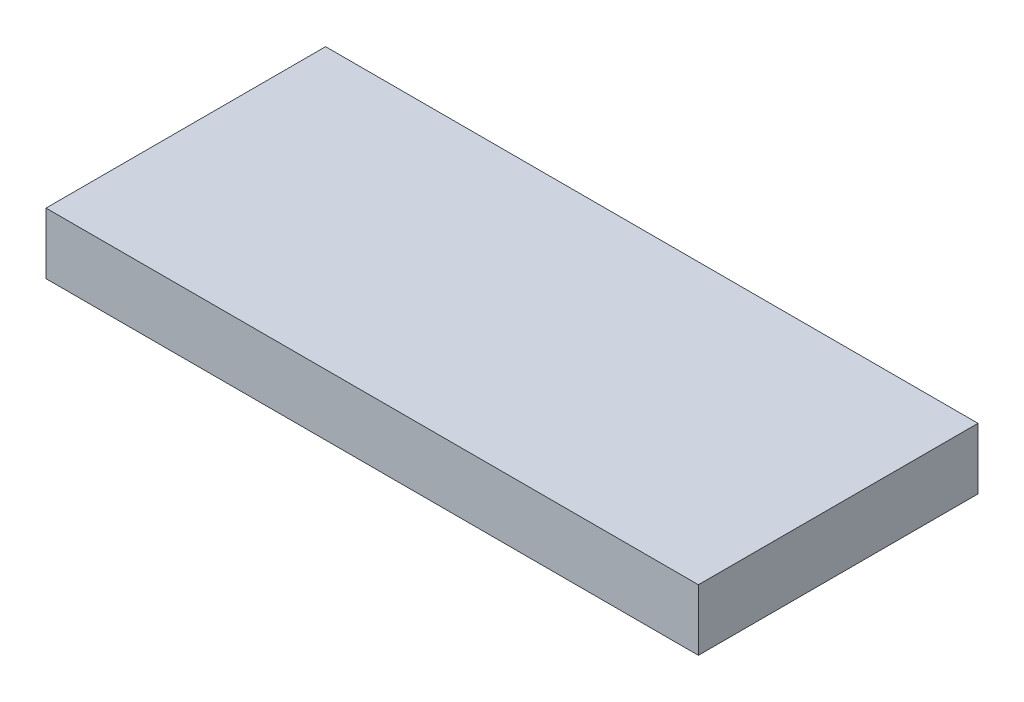
ISO-10303-21;
HEADER;
FILE_DESCRIPTION(('STEP AP214'),'2;1');
FILE_NAME('part.step','',(''),(''),'','','');
FILE_SCHEMA(('AUTOMOTIVE_DESIGN { 1 0 10303 214 1 1 1 1 }'));
ENDSEC;
DATA;
#1=APPLICATION_CONTEXT('core data for automotive mechanical design processes');
#2=APPLICATION_PROTOCOL_DEFINITION('international standard','automotive_design',2000,#1);
#3=PRODUCT_CONTEXT('',#1,'mechanical');
#4=PRODUCT('Part','Part','',(#3));
#5=PRODUCT_RELATED_PRODUCT_CATEGORY('part','',(#4));
#6=PRODUCT_DEFINITION_FORMATION('','',#4);
#7=PRODUCT_DEFINITION_CONTEXT('part definition',#1,'design');
#8=PRODUCT_DEFINITION('design','',#6,#7);
#9=PRODUCT_DEFINITION_SHAPE('','',#8);
#10=(LENGTH_UNIT() NAMED_UNIT(*) SI_UNIT(.MILLI.,.METRE.));
#11=(NAMED_UNIT(*) PLANE_ANGLE_UNIT() SI_UNIT($,.RADIAN.));
#12=(NAMED_UNIT(*) SI_UNIT($,.STERADIAN.) SOLID_ANGLE_UNIT());
#13=UNCERTAINTY_MEASURE_WITH_UNIT(LENGTH_MEASURE(1.E-05),#10,'distance_accuracy_value','');
#14=(GEOMETRIC_REPRESENTATION_CONTEXT(3) GLOBAL_UNCERTAINTY_ASSIGNED_CONTEXT((#13)) GLOBAL_UNIT_ASSIGNED_CONTEXT((#10,
#11,#12)) REPRESENTATION_CONTEXT('',''));
#15=CARTESIAN_POINT('',(0.,0.,0.));
#16=DIRECTION('',(0.,0.,1.));
#17=DIRECTION('',(1.,0.,0.));
#18=AXIS2_PLACEMENT_3D('',#15,#16,#17);
#19=CARTESIAN_POINT('',(26.67,5.,11.43));
#20=DIRECTION('',(-1.,0.,0.));
#21=DIRECTION('',(0.,0.,1.));
#22=AXIS2_PLACEMENT_3D('',#19,#20,#21);
#23=PLANE('',#22);
#24=DIRECTION('',(0.,0.,-1.));
#25=VECTOR('',#24,1.);
#26=CARTESIAN_POINT('',(26.67,0.,11.43));
#27=LINE('',#26,#25);
#28=CARTESIAN_POINT('',(26.67,0.,11.43));
#29=VERTEX_POINT('',#28);
#30=CARTESIAN_POINT('',(26.67,0.,-11.43));
#31=VERTEX_POINT('',#30);
#32=EDGE_CURVE('E111',#29,#31,#27,.T.);
#33=ORIENTED_EDGE('',*,*,#32,.T.);
#34=DIRECTION('',(0.,-1.,0.));
#35=VECTOR('',#34,1.);
#36=CARTESIAN_POINT('',(26.67,5.,-11.43));
#37=LINE('',#36,#35);
#38=CARTESIAN_POINT('',(26.67,5.,-11.43));
#39=VERTEX_POINT('',#38);
#40=EDGE_CURVE('E11',#39,#31,#37,.T.);
#41=ORIENTED_EDGE('',*,*,#40,.F.);
#42=DIRECTION('',(0.,0.,-1.));
#43=VECTOR('',#42,1.);
#44=CARTESIAN_POINT('',(26.67,5.,11.43));
#45=LINE('',#44,#43);
#46=CARTESIAN_POINT('',(26.67,5.,11.43));
#47=VERTEX_POINT('',#46);
#48=EDGE_CURVE('E95',#47,#39,#45,.T.);
#49=ORIENTED_EDGE('',*,*,#48,.F.);
#50=DIRECTION('',(0.,-1.,0.));
#51=VECTOR('',#50,1.);
#52=CARTESIAN_POINT('',(26.67,5.,11.43));
#53=LINE('',#52,#51);
#54=EDGE_CURVE('E107',#47,#29,#53,.T.);
#55=ORIENTED_EDGE('',*,*,#54,.T.);
#56=EDGE_LOOP('',(#33,#41,#49,#55));
#57=FACE_BOUND('',#56,.T.);
#58=ADVANCED_FACE('F43',(#57),#23,.F.);
#59=CARTESIAN_POINT('',(-26.67,5.,-11.43));
#60=DIRECTION('',(0.,0.,1.));
#61=DIRECTION('',(1.,0.,0.));
#62=AXIS2_PLACEMENT_3D('',#59,#60,#61);
#63=PLANE('',#62);
#64=DIRECTION('',(-1.,0.,0.));
#65=VECTOR('',#64,1.);
#66=CARTESIAN_POINT('',(-26.67,0.,-11.43));
#67=LINE('',#66,#65);
#68=CARTESIAN_POINT('',(-26.67,0.,-11.43));
#69=VERTEX_POINT('',#68);
#70=EDGE_CURVE('E100',#31,#69,#67,.T.);
#71=ORIENTED_EDGE('',*,*,#70,.T.);
#72=DIRECTION('',(0.,-1.,0.));
#73=VECTOR('',#72,1.);
#74=CARTESIAN_POINT('',(-26.67,5.,-11.43));
#75=LINE('',#74,#73);
#76=CARTESIAN_POINT('',(-26.67,5.,-11.43));
#77=VERTEX_POINT('',#76);
#78=EDGE_CURVE('E52',#77,#69,#75,.T.);
#79=ORIENTED_EDGE('',*,*,#78,.F.);
#80=DIRECTION('',(-1.,0.,0.));
#81=VECTOR('',#80,1.);
#82=CARTESIAN_POINT('',(-26.67,5.,-11.43));
#83=LINE('',#82,#81);
#84=EDGE_CURVE('E90',#39,#77,#83,.T.);
#85=ORIENTED_EDGE('',*,*,#84,.F.);
#86=ORIENTED_EDGE('',*,*,#40,.T.);
#87=EDGE_LOOP('',(#71,#79,#85,#86));
#88=FACE_BOUND('',#87,.T.);
#89=ADVANCED_FACE('F99',(#88),#63,.F.);
#90=CARTESIAN_POINT('',(-26.67,5.,11.43));
#91=DIRECTION('',(1.,0.,0.));
#92=DIRECTION('',(0.,0.,-1.));
#93=AXIS2_PLACEMENT_3D('',#90,#91,#92);
#94=PLANE('',#93);
#95=DIRECTION('',(0.,0.,1.));
#96=VECTOR('',#95,1.);
#97=CARTESIAN_POINT('',(-26.67,0.,11.43));
#98=LINE('',#97,#96);
#99=CARTESIAN_POINT('',(-26.67,0.,11.43));
#100=VERTEX_POINT('',#99);
#101=EDGE_CURVE('E77',#69,#100,#98,.T.);
#102=ORIENTED_EDGE('',*,*,#101,.T.);
#103=DIRECTION('',(0.,-1.,0.));
#104=VECTOR('',#103,1.);
#105=CARTESIAN_POINT('',(-26.67,5.,11.43));
#106=LINE('',#105,#104);
#107=CARTESIAN_POINT('',(-26.67,5.,11.43));
#108=VERTEX_POINT('',#107);
#109=EDGE_CURVE('E102',#108,#100,#106,.T.);
#110=ORIENTED_EDGE('',*,*,#109,.F.);
#111=DIRECTION('',(0.,0.,1.));
#112=VECTOR('',#111,1.);
#113=CARTESIAN_POINT('',(-26.67,5.,11.43));
#114=LINE('',#113,#112);
#115=EDGE_CURVE('E93',#77,#108,#114,.T.);
#116=ORIENTED_EDGE('',*,*,#115,.F.);
#117=ORIENTED_EDGE('',*,*,#78,.T.);
#118=EDGE_LOOP('',(#102,#110,#116,#117));
#119=FACE_BOUND('',#118,.T.);
#120=ADVANCED_FACE('F103',(#119),#94,.F.);
#121=CARTESIAN_POINT('',(-26.67,5.,11.43));
#122=DIRECTION('',(0.,0.,-1.));
#123=DIRECTION('',(-1.,0.,0.));
#124=AXIS2_PLACEMENT_3D('',#121,#122,#123);
#125=PLANE('',#124);
#126=DIRECTION('',(1.,0.,0.));
#127=VECTOR('',#126,1.);
#128=CARTESIAN_POINT('',(-26.67,0.,11.43));
#129=LINE('',#128,#127);
#130=EDGE_CURVE('E83',#100,#29,#129,.T.);
#131=ORIENTED_EDGE('',*,*,#130,.T.);
#132=ORIENTED_EDGE('',*,*,#54,.F.);
#133=DIRECTION('',(1.,0.,0.));
#134=VECTOR('',#133,1.);
#135=CARTESIAN_POINT('',(-26.67,5.,11.43));
#136=LINE('',#135,#134);
#137=EDGE_CURVE('E60',#108,#47,#136,.T.);
#138=ORIENTED_EDGE('',*,*,#137,.F.);
#139=ORIENTED_EDGE('',*,*,#109,.T.);
#140=EDGE_LOOP('',(#131,#132,#138,#139));
#141=FACE_BOUND('',#140,.T.);
#142=ADVANCED_FACE('F124',(#141),#125,.F.);
#143=CARTESIAN_POINT('',(0.,5.,0.));
#144=DIRECTION('',(0.,-1.,0.));
#145=DIRECTION('',(0.,0.,-1.));
#146=AXIS2_PLACEMENT_3D('',#143,#144,#145);
#147=PLANE('',#146);
#148=ORIENTED_EDGE('',*,*,#48,.T.);
#149=ORIENTED_EDGE('',*,*,#84,.T.);
#150=ORIENTED_EDGE('',*,*,#115,.T.);
#151=ORIENTED_EDGE('',*,*,#137,.T.);
#152=EDGE_LOOP('',(#148,#149,#150,#151));
#153=FACE_BOUND('',#152,.T.);
#154=ADVANCED_FACE('F91',(#153),#147,.F.);
#155=CARTESIAN_POINT('',(0.,0.,0.));
#156=DIRECTION('',(0.,-1.,0.));
#157=DIRECTION('',(0.,0.,-1.));
#158=AXIS2_PLACEMENT_3D('',#155,#156,#157);
#159=PLANE('',#158);
#160=ORIENTED_EDGE('',*,*,#32,.F.);
#161=ORIENTED_EDGE('',*,*,#130,.F.);
#162=ORIENTED_EDGE('',*,*,#101,.F.);
#163=ORIENTED_EDGE('',*,*,#70,.F.);
#164=EDGE_LOOP('',(#160,#161,#162,#163));
#165=FACE_BOUND('',#164,.T.);
#166=ADVANCED_FACE('F127',(#165),#159,.T.);
#167=CLOSED_SHELL('',(#58,#89,#120,#142,#154,#166));
#168=MANIFOLD_SOLID_BREP('B2',#167);
#169=ADVANCED_BREP_SHAPE_REPRESENTATION('',(#18,#168),#14);
#170=SHAPE_DEFINITION_REPRESENTATION(#9,#169);
ENDSEC;
END-ISO-10303-21;
